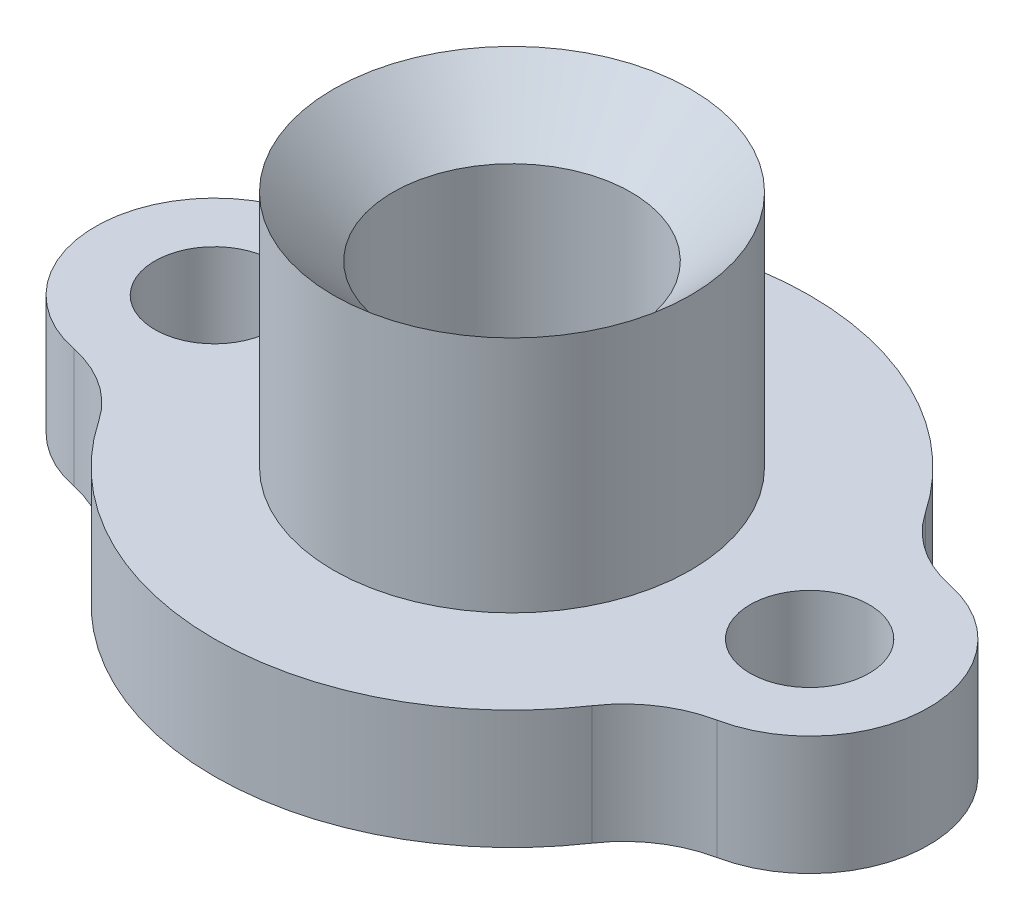
ISO-10303-21;
HEADER;
FILE_DESCRIPTION(('STEP AP214'),'2;1');
FILE_NAME('part.step','',(''),(''),'','','');
FILE_SCHEMA(('AUTOMOTIVE_DESIGN { 1 0 10303 214 1 1 1 1 }'));
ENDSEC;
DATA;
#1=APPLICATION_CONTEXT('core data for automotive mechanical design processes');
#2=APPLICATION_PROTOCOL_DEFINITION('international standard','automotive_design',2000,#1);
#3=PRODUCT_CONTEXT('',#1,'mechanical');
#4=PRODUCT('Part','Part','',(#3));
#5=PRODUCT_RELATED_PRODUCT_CATEGORY('part','',(#4));
#6=PRODUCT_DEFINITION_FORMATION('','',#4);
#7=PRODUCT_DEFINITION_CONTEXT('part definition',#1,'design');
#8=PRODUCT_DEFINITION('design','',#6,#7);
#9=PRODUCT_DEFINITION_SHAPE('','',#8);
#10=(LENGTH_UNIT() NAMED_UNIT(*) SI_UNIT(.MILLI.,.METRE.));
#11=(NAMED_UNIT(*) PLANE_ANGLE_UNIT() SI_UNIT($,.RADIAN.));
#12=(NAMED_UNIT(*) SI_UNIT($,.STERADIAN.) SOLID_ANGLE_UNIT());
#13=UNCERTAINTY_MEASURE_WITH_UNIT(LENGTH_MEASURE(1.E-05),#10,'distance_accuracy_value','');
#14=(GEOMETRIC_REPRESENTATION_CONTEXT(3) GLOBAL_UNCERTAINTY_ASSIGNED_CONTEXT((#13)) GLOBAL_UNIT_ASSIGNED_CONTEXT((#10,
#11,#12)) REPRESENTATION_CONTEXT('',''));
#15=CARTESIAN_POINT('',(0.,0.,0.));
#16=DIRECTION('',(0.,0.,1.));
#17=DIRECTION('',(1.,0.,0.));
#18=AXIS2_PLACEMENT_3D('',#15,#16,#17);
#19=CARTESIAN_POINT('',(-27.,10.,9.79795897113271));
#20=DIRECTION('',(0.,1.,0.));
#21=DIRECTION('',(0.,0.,1.));
#22=AXIS2_PLACEMENT_3D('',#19,#20,#21);
#23=PLANE('',#22);
#24=CARTESIAN_POINT('',(0.,10.,0.));
#25=DIRECTION('',(0.,1.,0.));
#26=DIRECTION('',(0.,0.,1.));
#27=AXIS2_PLACEMENT_3D('',#24,#25,#26);
#28=CIRCLE('',#27,15.);
#29=CARTESIAN_POINT('',(0.,10.,15.));
#30=VERTEX_POINT('',#29);
#31=EDGE_CURVE('E250',#30,#30,#28,.T.);
#32=ORIENTED_EDGE('',*,*,#31,.F.);
#33=EDGE_LOOP('',(#32));
#34=FACE_BOUND('',#33,.T.);
#35=CARTESIAN_POINT('',(25.,10.,0.));
#36=DIRECTION('',(0.,1.,0.));
#37=DIRECTION('',(0.,0.,1.));
#38=AXIS2_PLACEMENT_3D('',#35,#36,#37);
#39=CIRCLE('',#38,5.);
#40=CARTESIAN_POINT('',(25.,10.,5.));
#41=VERTEX_POINT('',#40);
#42=EDGE_CURVE('E142',#41,#41,#39,.T.);
#43=ORIENTED_EDGE('',*,*,#42,.F.);
#44=EDGE_LOOP('',(#43));
#45=FACE_BOUND('',#44,.T.);
#46=CARTESIAN_POINT('',(-29.,10.,19.5959179422654));
#47=DIRECTION('',(0.,-1.,0.));
#48=DIRECTION('',(0.,0.,1.));
#49=AXIS2_PLACEMENT_3D('',#46,#47,#48);
#50=CIRCLE('',#49,10.);
#51=CARTESIAN_POINT('',(-27.,10.,9.79795897113271));
#52=VERTEX_POINT('',#51);
#53=CARTESIAN_POINT('',(-20.7142857142857,10.,13.9970842444753));
#54=VERTEX_POINT('',#53);
#55=EDGE_CURVE('E153',#52,#54,#50,.T.);
#56=ORIENTED_EDGE('',*,*,#55,.T.);
#57=CARTESIAN_POINT('',(0.,10.,0.));
#58=DIRECTION('',(0.,1.,0.));
#59=DIRECTION('',(0.,0.,1.));
#60=AXIS2_PLACEMENT_3D('',#57,#58,#59);
#61=CIRCLE('',#60,25.);
#62=CARTESIAN_POINT('',(20.7142857142857,10.,13.9970842444753));
#63=VERTEX_POINT('',#62);
#64=EDGE_CURVE('E101',#54,#63,#61,.T.);
#65=ORIENTED_EDGE('',*,*,#64,.T.);
#66=CARTESIAN_POINT('',(29.,10.,19.5959179422654));
#67=DIRECTION('',(0.,-1.,0.));
#68=DIRECTION('',(0.,0.,-1.));
#69=AXIS2_PLACEMENT_3D('',#66,#67,#68);
#70=CIRCLE('',#69,10.);
#71=CARTESIAN_POINT('',(27.,10.,9.79795897113271));
#72=VERTEX_POINT('',#71);
#73=EDGE_CURVE('E233',#63,#72,#70,.T.);
#74=ORIENTED_EDGE('',*,*,#73,.T.);
#75=CARTESIAN_POINT('',(25.,10.,0.));
#76=DIRECTION('',(0.,1.,0.));
#77=DIRECTION('',(0.,0.,-1.));
#78=AXIS2_PLACEMENT_3D('',#75,#76,#77);
#79=CIRCLE('',#78,10.);
#80=CARTESIAN_POINT('',(27.,10.,-9.79795897113271));
#81=VERTEX_POINT('',#80);
#82=EDGE_CURVE('E235',#72,#81,#79,.T.);
#83=ORIENTED_EDGE('',*,*,#82,.T.);
#84=CARTESIAN_POINT('',(29.,10.,-19.5959179422654));
#85=DIRECTION('',(0.,-1.,0.));
#86=DIRECTION('',(0.,0.,1.));
#87=AXIS2_PLACEMENT_3D('',#84,#85,#86);
#88=CIRCLE('',#87,10.);
#89=CARTESIAN_POINT('',(20.7142857142857,10.,-13.9970842444753));
#90=VERTEX_POINT('',#89);
#91=EDGE_CURVE('E120',#81,#90,#88,.T.);
#92=ORIENTED_EDGE('',*,*,#91,.T.);
#93=CARTESIAN_POINT('',(0.,10.,0.));
#94=DIRECTION('',(0.,1.,0.));
#95=DIRECTION('',(0.,0.,1.));
#96=AXIS2_PLACEMENT_3D('',#93,#94,#95);
#97=CIRCLE('',#96,25.);
#98=CARTESIAN_POINT('',(-20.7142857142857,10.,-13.9970842444753));
#99=VERTEX_POINT('',#98);
#100=EDGE_CURVE('E114',#90,#99,#97,.T.);
#101=ORIENTED_EDGE('',*,*,#100,.T.);
#102=CARTESIAN_POINT('',(-29.,10.,-19.5959179422654));
#103=DIRECTION('',(0.,-1.,0.));
#104=DIRECTION('',(0.,0.,-1.));
#105=AXIS2_PLACEMENT_3D('',#102,#103,#104);
#106=CIRCLE('',#105,10.);
#107=CARTESIAN_POINT('',(-27.,10.,-9.79795897113271));
#108=VERTEX_POINT('',#107);
#109=EDGE_CURVE('E118',#99,#108,#106,.T.);
#110=ORIENTED_EDGE('',*,*,#109,.T.);
#111=CARTESIAN_POINT('',(-25.,10.,0.));
#112=DIRECTION('',(0.,1.,0.));
#113=DIRECTION('',(0.,0.,1.));
#114=AXIS2_PLACEMENT_3D('',#111,#112,#113);
#115=CIRCLE('',#114,10.);
#116=EDGE_CURVE('E57',#108,#52,#115,.T.);
#117=ORIENTED_EDGE('',*,*,#116,.T.);
#118=EDGE_LOOP('',(#56,#65,#74,#83,#92,#101,#110,#117));
#119=FACE_BOUND('',#118,.T.);
#120=CARTESIAN_POINT('',(-25.,10.,0.));
#121=DIRECTION('',(0.,1.,0.));
#122=DIRECTION('',(0.,0.,-1.));
#123=AXIS2_PLACEMENT_3D('',#120,#121,#122);
#124=CIRCLE('',#123,5.);
#125=CARTESIAN_POINT('',(-25.,10.,-5.));
#126=VERTEX_POINT('',#125);
#127=EDGE_CURVE('E244',#126,#126,#124,.T.);
#128=ORIENTED_EDGE('',*,*,#127,.F.);
#129=EDGE_LOOP('',(#128));
#130=FACE_BOUND('',#129,.T.);
#131=ADVANCED_FACE('F39',(#34,#45,#119,#130),#23,.T.);
#132=CARTESIAN_POINT('',(-27.,0.,9.79795897113271));
#133=DIRECTION('',(0.,1.,0.));
#134=DIRECTION('',(0.,0.,1.));
#135=AXIS2_PLACEMENT_3D('',#132,#133,#134);
#136=PLANE('',#135);
#137=CARTESIAN_POINT('',(-29.,0.,19.5959179422654));
#138=DIRECTION('',(0.,-1.,0.));
#139=DIRECTION('',(0.,0.,1.));
#140=AXIS2_PLACEMENT_3D('',#137,#138,#139);
#141=CIRCLE('',#140,10.);
#142=CARTESIAN_POINT('',(-27.,0.,9.79795897113271));
#143=VERTEX_POINT('',#142);
#144=CARTESIAN_POINT('',(-20.7142857142857,0.,13.9970842444753));
#145=VERTEX_POINT('',#144);
#146=EDGE_CURVE('E138',#143,#145,#141,.T.);
#147=ORIENTED_EDGE('',*,*,#146,.F.);
#148=CARTESIAN_POINT('',(-25.,0.,0.));
#149=DIRECTION('',(0.,1.,0.));
#150=DIRECTION('',(0.,0.,1.));
#151=AXIS2_PLACEMENT_3D('',#148,#149,#150);
#152=CIRCLE('',#151,10.);
#153=CARTESIAN_POINT('',(-27.,0.,-9.79795897113271));
#154=VERTEX_POINT('',#153);
#155=EDGE_CURVE('E92',#154,#143,#152,.T.);
#156=ORIENTED_EDGE('',*,*,#155,.F.);
#157=CARTESIAN_POINT('',(-29.,0.,-19.5959179422654));
#158=DIRECTION('',(0.,-1.,0.));
#159=DIRECTION('',(0.,0.,-1.));
#160=AXIS2_PLACEMENT_3D('',#157,#158,#159);
#161=CIRCLE('',#160,10.);
#162=CARTESIAN_POINT('',(-20.7142857142857,0.,-13.9970842444753));
#163=VERTEX_POINT('',#162);
#164=EDGE_CURVE('E86',#163,#154,#161,.T.);
#165=ORIENTED_EDGE('',*,*,#164,.F.);
#166=CARTESIAN_POINT('',(0.,0.,0.));
#167=DIRECTION('',(0.,1.,0.));
#168=DIRECTION('',(0.,0.,1.));
#169=AXIS2_PLACEMENT_3D('',#166,#167,#168);
#170=CIRCLE('',#169,25.);
#171=CARTESIAN_POINT('',(20.7142857142857,0.,-13.9970842444753));
#172=VERTEX_POINT('',#171);
#173=EDGE_CURVE('E128',#172,#163,#170,.T.);
#174=ORIENTED_EDGE('',*,*,#173,.F.);
#175=CARTESIAN_POINT('',(29.,0.,-19.5959179422654));
#176=DIRECTION('',(0.,-1.,0.));
#177=DIRECTION('',(0.,0.,1.));
#178=AXIS2_PLACEMENT_3D('',#175,#176,#177);
#179=CIRCLE('',#178,10.);
#180=CARTESIAN_POINT('',(27.,0.,-9.79795897113271));
#181=VERTEX_POINT('',#180);
#182=EDGE_CURVE('E148',#181,#172,#179,.T.);
#183=ORIENTED_EDGE('',*,*,#182,.F.);
#184=CARTESIAN_POINT('',(25.,0.,0.));
#185=DIRECTION('',(0.,1.,0.));
#186=DIRECTION('',(0.,0.,-1.));
#187=AXIS2_PLACEMENT_3D('',#184,#185,#186);
#188=CIRCLE('',#187,10.);
#189=CARTESIAN_POINT('',(27.,0.,9.79795897113271));
#190=VERTEX_POINT('',#189);
#191=EDGE_CURVE('E146',#190,#181,#188,.T.);
#192=ORIENTED_EDGE('',*,*,#191,.F.);
#193=CARTESIAN_POINT('',(29.,0.,19.5959179422654));
#194=DIRECTION('',(0.,-1.,0.));
#195=DIRECTION('',(0.,0.,-1.));
#196=AXIS2_PLACEMENT_3D('',#193,#194,#195);
#197=CIRCLE('',#196,10.);
#198=CARTESIAN_POINT('',(20.7142857142857,0.,13.9970842444753));
#199=VERTEX_POINT('',#198);
#200=EDGE_CURVE('E144',#199,#190,#197,.T.);
#201=ORIENTED_EDGE('',*,*,#200,.F.);
#202=CARTESIAN_POINT('',(0.,0.,0.));
#203=DIRECTION('',(0.,1.,0.));
#204=DIRECTION('',(0.,0.,1.));
#205=AXIS2_PLACEMENT_3D('',#202,#203,#204);
#206=CIRCLE('',#205,25.);
#207=EDGE_CURVE('E141',#145,#199,#206,.T.);
#208=ORIENTED_EDGE('',*,*,#207,.F.);
#209=EDGE_LOOP('',(#147,#156,#165,#174,#183,#192,#201,#208));
#210=FACE_BOUND('',#209,.T.);
#211=CARTESIAN_POINT('',(25.,0.,0.));
#212=DIRECTION('',(0.,1.,0.));
#213=DIRECTION('',(0.,0.,1.));
#214=AXIS2_PLACEMENT_3D('',#211,#212,#213);
#215=CIRCLE('',#214,5.);
#216=CARTESIAN_POINT('',(25.,0.,5.));
#217=VERTEX_POINT('',#216);
#218=EDGE_CURVE('E241',#217,#217,#215,.T.);
#219=ORIENTED_EDGE('',*,*,#218,.T.);
#220=EDGE_LOOP('',(#219));
#221=FACE_BOUND('',#220,.T.);
#222=CARTESIAN_POINT('',(-25.,0.,0.));
#223=DIRECTION('',(0.,1.,0.));
#224=DIRECTION('',(0.,0.,-1.));
#225=AXIS2_PLACEMENT_3D('',#222,#223,#224);
#226=CIRCLE('',#225,5.);
#227=CARTESIAN_POINT('',(-25.,0.,-5.));
#228=VERTEX_POINT('',#227);
#229=EDGE_CURVE('E247',#228,#228,#226,.T.);
#230=ORIENTED_EDGE('',*,*,#229,.T.);
#231=EDGE_LOOP('',(#230));
#232=FACE_BOUND('',#231,.T.);
#233=ADVANCED_FACE('F186',(#210,#221,#232),#136,.F.);
#234=CARTESIAN_POINT('',(-29.,10.,19.5959179422654));
#235=DIRECTION('',(0.,-1.,0.));
#236=DIRECTION('',(0.,0.,-1.));
#237=AXIS2_PLACEMENT_3D('',#234,#235,#236);
#238=CYLINDRICAL_SURFACE('',#237,10.);
#239=ORIENTED_EDGE('',*,*,#146,.T.);
#240=DIRECTION('',(0.,-1.,0.));
#241=VECTOR('',#240,1.);
#242=CARTESIAN_POINT('',(-20.7142857142857,10.,13.9970842444753));
#243=LINE('',#242,#241);
#244=EDGE_CURVE('E166',#54,#145,#243,.T.);
#245=ORIENTED_EDGE('',*,*,#244,.F.);
#246=ORIENTED_EDGE('',*,*,#55,.F.);
#247=DIRECTION('',(0.,-1.,0.));
#248=VECTOR('',#247,1.);
#249=CARTESIAN_POINT('',(-27.,10.,9.79795897113271));
#250=LINE('',#249,#248);
#251=EDGE_CURVE('E134',#52,#143,#250,.T.);
#252=ORIENTED_EDGE('',*,*,#251,.T.);
#253=EDGE_LOOP('',(#239,#245,#246,#252));
#254=FACE_BOUND('',#253,.T.);
#255=ADVANCED_FACE('F191',(#254),#238,.F.);
#256=CARTESIAN_POINT('',(0.,10.,0.));
#257=DIRECTION('',(0.,-1.,0.));
#258=DIRECTION('',(0.,0.,-1.));
#259=AXIS2_PLACEMENT_3D('',#256,#257,#258);
#260=CYLINDRICAL_SURFACE('',#259,25.);
#261=ORIENTED_EDGE('',*,*,#207,.T.);
#262=DIRECTION('',(0.,-1.,0.));
#263=VECTOR('',#262,1.);
#264=CARTESIAN_POINT('',(20.7142857142857,10.,13.9970842444753));
#265=LINE('',#264,#263);
#266=EDGE_CURVE('E163',#63,#199,#265,.T.);
#267=ORIENTED_EDGE('',*,*,#266,.F.);
#268=ORIENTED_EDGE('',*,*,#64,.F.);
#269=ORIENTED_EDGE('',*,*,#244,.T.);
#270=EDGE_LOOP('',(#261,#267,#268,#269));
#271=FACE_BOUND('',#270,.T.);
#272=ADVANCED_FACE('F218',(#271),#260,.T.);
#273=CARTESIAN_POINT('',(29.,10.,19.5959179422654));
#274=DIRECTION('',(0.,-1.,0.));
#275=DIRECTION('',(0.,0.,-1.));
#276=AXIS2_PLACEMENT_3D('',#273,#274,#275);
#277=CYLINDRICAL_SURFACE('',#276,10.);
#278=ORIENTED_EDGE('',*,*,#200,.T.);
#279=DIRECTION('',(0.,-1.,0.));
#280=VECTOR('',#279,1.);
#281=CARTESIAN_POINT('',(27.,10.,9.79795897113271));
#282=LINE('',#281,#280);
#283=EDGE_CURVE('E160',#72,#190,#282,.T.);
#284=ORIENTED_EDGE('',*,*,#283,.F.);
#285=ORIENTED_EDGE('',*,*,#73,.F.);
#286=ORIENTED_EDGE('',*,*,#266,.T.);
#287=EDGE_LOOP('',(#278,#284,#285,#286));
#288=FACE_BOUND('',#287,.T.);
#289=ADVANCED_FACE('F214',(#288),#277,.F.);
#290=CARTESIAN_POINT('',(25.,10.,0.));
#291=DIRECTION('',(0.,-1.,0.));
#292=DIRECTION('',(0.,0.,-1.));
#293=AXIS2_PLACEMENT_3D('',#290,#291,#292);
#294=CYLINDRICAL_SURFACE('',#293,10.);
#295=ORIENTED_EDGE('',*,*,#191,.T.);
#296=DIRECTION('',(0.,-1.,0.));
#297=VECTOR('',#296,1.);
#298=CARTESIAN_POINT('',(27.,10.,-9.79795897113271));
#299=LINE('',#298,#297);
#300=EDGE_CURVE('E157',#81,#181,#299,.T.);
#301=ORIENTED_EDGE('',*,*,#300,.F.);
#302=ORIENTED_EDGE('',*,*,#82,.F.);
#303=ORIENTED_EDGE('',*,*,#283,.T.);
#304=EDGE_LOOP('',(#295,#301,#302,#303));
#305=FACE_BOUND('',#304,.T.);
#306=ADVANCED_FACE('F210',(#305),#294,.T.);
#307=CARTESIAN_POINT('',(29.,10.,-19.5959179422654));
#308=DIRECTION('',(0.,-1.,0.));
#309=DIRECTION('',(0.,0.,-1.));
#310=AXIS2_PLACEMENT_3D('',#307,#308,#309);
#311=CYLINDRICAL_SURFACE('',#310,10.);
#312=ORIENTED_EDGE('',*,*,#182,.T.);
#313=DIRECTION('',(0.,-1.,0.));
#314=VECTOR('',#313,1.);
#315=CARTESIAN_POINT('',(20.7142857142857,10.,-13.9970842444753));
#316=LINE('',#315,#314);
#317=EDGE_CURVE('E129',#90,#172,#316,.T.);
#318=ORIENTED_EDGE('',*,*,#317,.F.);
#319=ORIENTED_EDGE('',*,*,#91,.F.);
#320=ORIENTED_EDGE('',*,*,#300,.T.);
#321=EDGE_LOOP('',(#312,#318,#319,#320));
#322=FACE_BOUND('',#321,.T.);
#323=ADVANCED_FACE('F207',(#322),#311,.F.);
#324=CARTESIAN_POINT('',(0.,10.,0.));
#325=DIRECTION('',(0.,-1.,0.));
#326=DIRECTION('',(0.,0.,-1.));
#327=AXIS2_PLACEMENT_3D('',#324,#325,#326);
#328=CYLINDRICAL_SURFACE('',#327,25.);
#329=ORIENTED_EDGE('',*,*,#173,.T.);
#330=DIRECTION('',(0.,-1.,0.));
#331=VECTOR('',#330,1.);
#332=CARTESIAN_POINT('',(-20.7142857142857,10.,-13.9970842444753));
#333=LINE('',#332,#331);
#334=EDGE_CURVE('E125',#99,#163,#333,.T.);
#335=ORIENTED_EDGE('',*,*,#334,.F.);
#336=ORIENTED_EDGE('',*,*,#100,.F.);
#337=ORIENTED_EDGE('',*,*,#317,.T.);
#338=EDGE_LOOP('',(#329,#335,#336,#337));
#339=FACE_BOUND('',#338,.T.);
#340=ADVANCED_FACE('F126',(#339),#328,.T.);
#341=CARTESIAN_POINT('',(-29.,10.,-19.5959179422654));
#342=DIRECTION('',(0.,-1.,0.));
#343=DIRECTION('',(0.,0.,-1.));
#344=AXIS2_PLACEMENT_3D('',#341,#342,#343);
#345=CYLINDRICAL_SURFACE('',#344,10.);
#346=ORIENTED_EDGE('',*,*,#164,.T.);
#347=DIRECTION('',(0.,-1.,0.));
#348=VECTOR('',#347,1.);
#349=CARTESIAN_POINT('',(-27.,10.,-9.79795897113271));
#350=LINE('',#349,#348);
#351=EDGE_CURVE('E130',#108,#154,#350,.T.);
#352=ORIENTED_EDGE('',*,*,#351,.F.);
#353=ORIENTED_EDGE('',*,*,#109,.F.);
#354=ORIENTED_EDGE('',*,*,#334,.T.);
#355=EDGE_LOOP('',(#346,#352,#353,#354));
#356=FACE_BOUND('',#355,.T.);
#357=ADVANCED_FACE('F132',(#356),#345,.F.);
#358=CARTESIAN_POINT('',(-25.,10.,0.));
#359=DIRECTION('',(0.,-1.,0.));
#360=DIRECTION('',(0.,0.,-1.));
#361=AXIS2_PLACEMENT_3D('',#358,#359,#360);
#362=CYLINDRICAL_SURFACE('',#361,10.);
#363=ORIENTED_EDGE('',*,*,#155,.T.);
#364=ORIENTED_EDGE('',*,*,#251,.F.);
#365=ORIENTED_EDGE('',*,*,#116,.F.);
#366=ORIENTED_EDGE('',*,*,#351,.T.);
#367=EDGE_LOOP('',(#363,#364,#365,#366));
#368=FACE_BOUND('',#367,.T.);
#369=ADVANCED_FACE('F200',(#368),#362,.T.);
#370=CARTESIAN_POINT('',(25.,10.,0.));
#371=DIRECTION('',(0.,-1.,0.));
#372=DIRECTION('',(0.,0.,-1.));
#373=AXIS2_PLACEMENT_3D('',#370,#371,#372);
#374=CYLINDRICAL_SURFACE('',#373,5.);
#375=ORIENTED_EDGE('',*,*,#42,.T.);
#376=EDGE_LOOP('',(#375));
#377=FACE_BOUND('',#376,.T.);
#378=ORIENTED_EDGE('',*,*,#218,.F.);
#379=EDGE_LOOP('',(#378));
#380=FACE_BOUND('',#379,.T.);
#381=ADVANCED_FACE('F197',(#377,#380),#374,.F.);
#382=CARTESIAN_POINT('',(-25.,10.,0.));
#383=DIRECTION('',(0.,-1.,0.));
#384=DIRECTION('',(0.,0.,-1.));
#385=AXIS2_PLACEMENT_3D('',#382,#383,#384);
#386=CYLINDRICAL_SURFACE('',#385,5.);
#387=ORIENTED_EDGE('',*,*,#127,.T.);
#388=EDGE_LOOP('',(#387));
#389=FACE_BOUND('',#388,.T.);
#390=ORIENTED_EDGE('',*,*,#229,.F.);
#391=EDGE_LOOP('',(#390));
#392=FACE_BOUND('',#391,.T.);
#393=ADVANCED_FACE('F257',(#389,#392),#386,.F.);
#394=CARTESIAN_POINT('',(0.,35.,0.));
#395=DIRECTION('',(0.,-1.,0.));
#396=DIRECTION('',(0.,0.,-1.));
#397=AXIS2_PLACEMENT_3D('',#394,#395,#396);
#398=CYLINDRICAL_SURFACE('',#397,15.);
#399=CARTESIAN_POINT('',(0.,29.9999999999999,0.));
#400=DIRECTION('',(0.,1.,0.));
#401=DIRECTION('',(0.,0.,1.));
#402=AXIS2_PLACEMENT_3D('',#399,#400,#401);
#403=CIRCLE('',#402,15.);
#404=CARTESIAN_POINT('',(0.,29.9999999999999,15.));
#405=VERTEX_POINT('',#404);
#406=EDGE_CURVE('E11',#405,#405,#403,.F.);
#407=ORIENTED_EDGE('',*,*,#406,.T.);
#408=EDGE_LOOP('',(#407));
#409=FACE_BOUND('',#408,.T.);
#410=ORIENTED_EDGE('',*,*,#31,.T.);
#411=EDGE_LOOP('',(#410));
#412=FACE_BOUND('',#411,.T.);
#413=ADVANCED_FACE('F255',(#409,#412),#398,.T.);
#414=CARTESIAN_POINT('',(0.,35.,0.));
#415=DIRECTION('',(0.,-1.,0.));
#416=DIRECTION('',(0.,0.,-1.));
#417=AXIS2_PLACEMENT_3D('',#414,#415,#416);
#418=CYLINDRICAL_SURFACE('',#417,10.);
#419=CARTESIAN_POINT('',(0.,24.9999999999998,0.));
#420=DIRECTION('',(0.,1.,0.));
#421=DIRECTION('',(0.,0.,1.));
#422=AXIS2_PLACEMENT_3D('',#419,#420,#421);
#423=CIRCLE('',#422,10.);
#424=CARTESIAN_POINT('',(0.,24.9999999999998,10.));
#425=VERTEX_POINT('',#424);
#426=EDGE_CURVE('E49',#425,#425,#423,.T.);
#427=ORIENTED_EDGE('',*,*,#426,.T.);
#428=EDGE_LOOP('',(#427));
#429=FACE_BOUND('',#428,.T.);
#430=CARTESIAN_POINT('',(0.,10.,0.));
#431=DIRECTION('',(0.,1.,0.));
#432=DIRECTION('',(0.,0.,1.));
#433=AXIS2_PLACEMENT_3D('',#430,#431,#432);
#434=CIRCLE('',#433,10.);
#435=CARTESIAN_POINT('',(0.,10.,10.));
#436=VERTEX_POINT('',#435);
#437=EDGE_CURVE('E168',#436,#436,#434,.F.);
#438=ORIENTED_EDGE('',*,*,#437,.T.);
#439=EDGE_LOOP('',(#438));
#440=FACE_BOUND('',#439,.T.);
#441=ADVANCED_FACE('F173',(#429,#440),#418,.F.);
#442=ORIENTED_EDGE('',*,*,#437,.F.);
#443=EDGE_LOOP('',(#442));
#444=FACE_BOUND('',#443,.T.);
#445=ADVANCED_FACE('F177',(#444),#23,.T.);
#446=CARTESIAN_POINT('',(0.,24.9999999999998,0.));
#447=DIRECTION('',(0.,1.,0.));
#448=DIRECTION('',(0.,0.,1.));
#449=AXIS2_PLACEMENT_3D('',#446,#447,#448);
#450=CONICAL_SURFACE('',#449,10.,0.785398163397443);
#451=ORIENTED_EDGE('',*,*,#406,.F.);
#452=EDGE_LOOP('',(#451));
#453=FACE_BOUND('',#452,.T.);
#454=ORIENTED_EDGE('',*,*,#426,.F.);
#455=EDGE_LOOP('',(#454));
#456=FACE_BOUND('',#455,.T.);
#457=ADVANCED_FACE('F42',(#453,#456),#450,.F.);
#458=CLOSED_SHELL('',(#131,#233,#255,#272,#289,#306,#323,#340,#357,#369,#381,#393,#413,#441,
#445,#457));
#459=MANIFOLD_SOLID_BREP('B2',#458);
#460=ADVANCED_BREP_SHAPE_REPRESENTATION('',(#18,#459),#14);
#461=SHAPE_DEFINITION_REPRESENTATION(#9,#460);
ENDSEC;
END-ISO-10303-21;
